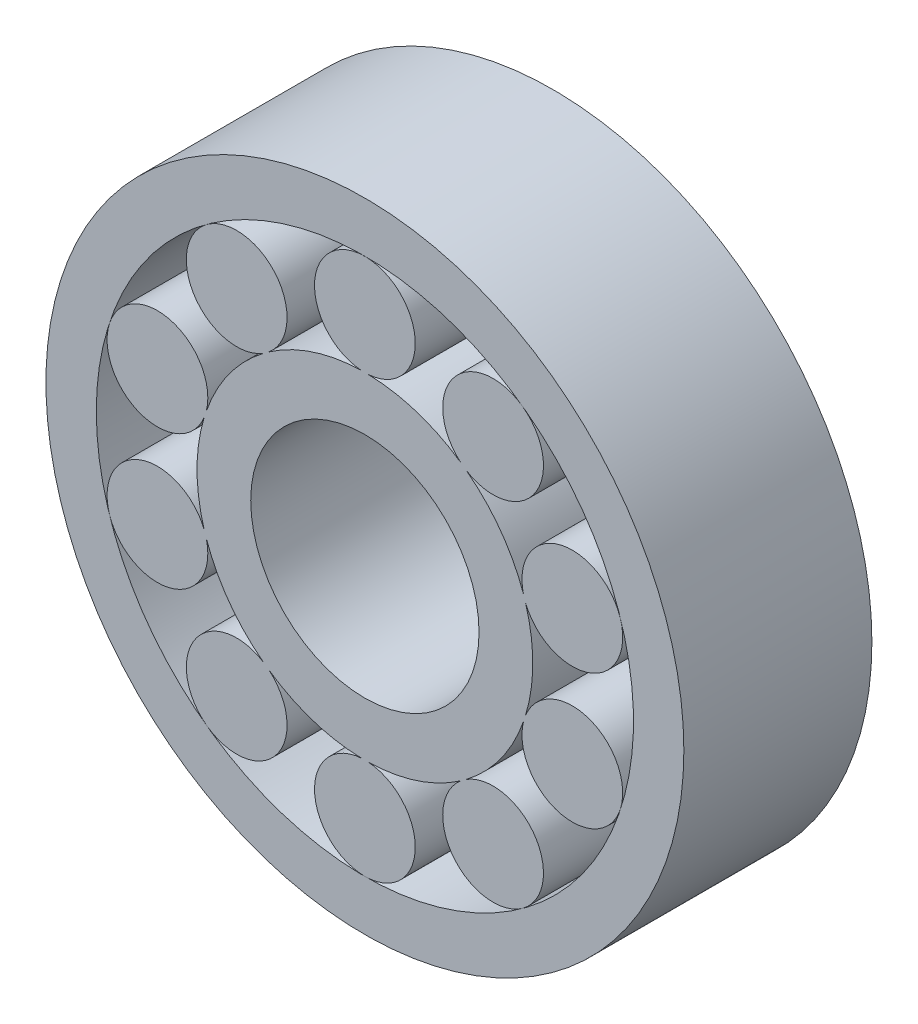
ISO-10303-21;
HEADER;
FILE_DESCRIPTION(('STEP AP214'),'2;1');
FILE_NAME('part.step','',(''),(''),'','','');
FILE_SCHEMA(('AUTOMOTIVE_DESIGN { 1 0 10303 214 1 1 1 1 }'));
ENDSEC;
DATA;
#1=APPLICATION_CONTEXT('core data for automotive mechanical design processes');
#2=APPLICATION_PROTOCOL_DEFINITION('international standard','automotive_design',2000,#1);
#3=PRODUCT_CONTEXT('',#1,'mechanical');
#4=PRODUCT('Part','Part','',(#3));
#5=PRODUCT_RELATED_PRODUCT_CATEGORY('part','',(#4));
#6=PRODUCT_DEFINITION_FORMATION('','',#4);
#7=PRODUCT_DEFINITION_CONTEXT('part definition',#1,'design');
#8=PRODUCT_DEFINITION('design','',#6,#7);
#9=PRODUCT_DEFINITION_SHAPE('','',#8);
#10=(LENGTH_UNIT() NAMED_UNIT(*) SI_UNIT(.MILLI.,.METRE.));
#11=(NAMED_UNIT(*) PLANE_ANGLE_UNIT() SI_UNIT($,.RADIAN.));
#12=(NAMED_UNIT(*) SI_UNIT($,.STERADIAN.) SOLID_ANGLE_UNIT());
#13=UNCERTAINTY_MEASURE_WITH_UNIT(LENGTH_MEASURE(1.E-05),#10,'distance_accuracy_value','');
#14=(GEOMETRIC_REPRESENTATION_CONTEXT(3) GLOBAL_UNCERTAINTY_ASSIGNED_CONTEXT((#13)) GLOBAL_UNIT_ASSIGNED_CONTEXT((#10,
#11,#12)) REPRESENTATION_CONTEXT('',''));
#15=CARTESIAN_POINT('',(0.,0.,0.));
#16=DIRECTION('',(0.,0.,1.));
#17=DIRECTION('',(1.,0.,0.));
#18=AXIS2_PLACEMENT_3D('',#15,#16,#17);
#19=CARTESIAN_POINT('',(0.,0.,14.));
#20=DIRECTION('',(0.,0.,1.));
#21=DIRECTION('',(1.,0.,0.));
#22=AXIS2_PLACEMENT_3D('',#19,#20,#21);
#23=PLANE('',#22);
#24=CARTESIAN_POINT('',(0.,0.,14.));
#25=DIRECTION('',(0.,0.,-1.));
#26=DIRECTION('',(-1.,0.,0.));
#27=AXIS2_PLACEMENT_3D('',#24,#25,#26);
#28=CIRCLE('',#27,20.);
#29=CARTESIAN_POINT('',(-20.,0.,14.));
#30=VERTEX_POINT('',#29);
#31=EDGE_CURVE('E60',#30,#30,#28,.T.);
#32=ORIENTED_EDGE('',*,*,#31,.T.);
#33=EDGE_LOOP('',(#32));
#34=FACE_BOUND('',#33,.T.);
#35=CARTESIAN_POINT('',(0.,0.,14.));
#36=DIRECTION('',(0.,0.,1.));
#37=DIRECTION('',(1.,0.,0.));
#38=AXIS2_PLACEMENT_3D('',#35,#36,#37);
#39=CIRCLE('',#38,23.75);
#40=CARTESIAN_POINT('',(23.75,0.,14.));
#41=VERTEX_POINT('',#40);
#42=EDGE_CURVE('E63',#41,#41,#39,.T.);
#43=ORIENTED_EDGE('',*,*,#42,.T.);
#44=EDGE_LOOP('',(#43));
#45=FACE_BOUND('',#44,.T.);
#46=ADVANCED_FACE('F52',(#34,#45),#23,.T.);
#47=CARTESIAN_POINT('',(0.,0.,0.));
#48=DIRECTION('',(0.,0.,1.));
#49=DIRECTION('',(1.,0.,0.));
#50=AXIS2_PLACEMENT_3D('',#47,#48,#49);
#51=PLANE('',#50);
#52=CARTESIAN_POINT('',(0.,0.,0.));
#53=DIRECTION('',(0.,0.,-1.));
#54=DIRECTION('',(-1.,0.,0.));
#55=AXIS2_PLACEMENT_3D('',#52,#53,#54);
#56=CIRCLE('',#55,20.);
#57=CARTESIAN_POINT('',(-20.,0.,0.));
#58=VERTEX_POINT('',#57);
#59=EDGE_CURVE('E11',#58,#58,#56,.T.);
#60=ORIENTED_EDGE('',*,*,#59,.F.);
#61=EDGE_LOOP('',(#60));
#62=FACE_BOUND('',#61,.T.);
#63=CARTESIAN_POINT('',(0.,0.,0.));
#64=DIRECTION('',(0.,0.,1.));
#65=DIRECTION('',(1.,0.,0.));
#66=AXIS2_PLACEMENT_3D('',#63,#64,#65);
#67=CIRCLE('',#66,23.75);
#68=CARTESIAN_POINT('',(23.75,0.,0.));
#69=VERTEX_POINT('',#68);
#70=EDGE_CURVE('E62',#69,#69,#67,.T.);
#71=ORIENTED_EDGE('',*,*,#70,.F.);
#72=EDGE_LOOP('',(#71));
#73=FACE_BOUND('',#72,.T.);
#74=ADVANCED_FACE('F54',(#62,#73),#51,.F.);
#75=CARTESIAN_POINT('',(0.,0.,14.));
#76=DIRECTION('',(0.,0.,-1.));
#77=DIRECTION('',(-1.,0.,0.));
#78=AXIS2_PLACEMENT_3D('',#75,#76,#77);
#79=CYLINDRICAL_SURFACE('',#78,23.75);
#80=ORIENTED_EDGE('',*,*,#42,.F.);
#81=EDGE_LOOP('',(#80));
#82=FACE_BOUND('',#81,.T.);
#83=ORIENTED_EDGE('',*,*,#70,.T.);
#84=EDGE_LOOP('',(#83));
#85=FACE_BOUND('',#84,.T.);
#86=ADVANCED_FACE('F80',(#82,#85),#79,.T.);
#87=CARTESIAN_POINT('',(0.,0.,14.));
#88=DIRECTION('',(0.,0.,-1.));
#89=DIRECTION('',(-1.,0.,0.));
#90=AXIS2_PLACEMENT_3D('',#87,#88,#89);
#91=CYLINDRICAL_SURFACE('',#90,20.);
#92=ORIENTED_EDGE('',*,*,#31,.F.);
#93=EDGE_LOOP('',(#92));
#94=FACE_BOUND('',#93,.T.);
#95=ORIENTED_EDGE('',*,*,#59,.T.);
#96=EDGE_LOOP('',(#95));
#97=FACE_BOUND('',#96,.T.);
#98=ADVANCED_FACE('F73',(#94,#97),#91,.F.);
#99=CLOSED_SHELL('',(#46,#74,#86,#98));
#100=MANIFOLD_SOLID_BREP('B2',#99);
#101=CARTESIAN_POINT('',(0.,0.,14.));
#102=DIRECTION('',(0.,0.,-1.));
#103=DIRECTION('',(-1.,0.,0.));
#104=AXIS2_PLACEMENT_3D('',#101,#102,#103);
#105=CYLINDRICAL_SURFACE('',#104,12.5);
#106=DIRECTION('',(0.,0.,-1.));
#107=VECTOR('',#106,1.);
#108=CARTESIAN_POINT('',(7.54020102676842,9.96972258771128,7.));
#109=LINE('',#108,#107);
#110=CARTESIAN_POINT('',(7.54020102676835,9.96972258771133,14.));
#111=VERTEX_POINT('',#110);
#112=CARTESIAN_POINT('',(7.54020102676835,9.96972258771133,0.));
#113=VERTEX_POINT('',#112);
#114=EDGE_CURVE('E51',#111,#113,#109,.T.);
#115=ORIENTED_EDGE('',*,*,#114,.F.);
#116=CARTESIAN_POINT('',(0.,0.,14.));
#117=DIRECTION('',(0.,0.,-1.));
#118=DIRECTION('',(-1.,0.,0.));
#119=AXIS2_PLACEMENT_3D('',#116,#117,#118);
#120=CIRCLE('',#119,12.5);
#121=CARTESIAN_POINT('',(11.8118198909726,4.09034361187721,14.));
#122=VERTEX_POINT('',#121);
#123=EDGE_CURVE('E257',#111,#122,#120,.T.);
#124=ORIENTED_EDGE('',*,*,#123,.T.);
#125=DIRECTION('',(0.,0.,-1.));
#126=VECTOR('',#125,1.);
#127=CARTESIAN_POINT('',(11.8118198909726,4.09034361187724,7.));
#128=LINE('',#127,#126);
#129=CARTESIAN_POINT('',(11.8118198909726,4.09034361187721,0.));
#130=VERTEX_POINT('',#129);
#131=EDGE_CURVE('E424',#130,#122,#128,.F.);
#132=ORIENTED_EDGE('',*,*,#131,.F.);
#133=CARTESIAN_POINT('',(0.,0.,0.));
#134=DIRECTION('',(0.,0.,-1.));
#135=DIRECTION('',(-1.,0.,0.));
#136=AXIS2_PLACEMENT_3D('',#133,#134,#135);
#137=CIRCLE('',#136,12.5);
#138=EDGE_CURVE('E131',#113,#130,#137,.T.);
#139=ORIENTED_EDGE('',*,*,#138,.F.);
#140=EDGE_LOOP('',(#115,#124,#132,#139));
#141=FACE_BOUND('',#140,.T.);
#142=ADVANCED_FACE('F113',(#141),#105,.T.);
#143=DIRECTION('',(0.,0.,-1.));
#144=VECTOR('',#143,1.);
#145=CARTESIAN_POINT('',(11.9602066781629,3.63365603980714,7.));
#146=LINE('',#145,#144);
#147=CARTESIAN_POINT('',(11.9602066781629,3.63365603980717,14.));
#148=VERTEX_POINT('',#147);
#149=CARTESIAN_POINT('',(11.9602066781629,3.63365603980717,0.));
#150=VERTEX_POINT('',#149);
#151=EDGE_CURVE('E271',#148,#150,#146,.T.);
#152=ORIENTED_EDGE('',*,*,#151,.F.);
#153=CARTESIAN_POINT('',(11.960206678163,-3.63365603980698,14.));
#154=VERTEX_POINT('',#153);
#155=EDGE_CURVE('E442',#148,#154,#120,.T.);
#156=ORIENTED_EDGE('',*,*,#155,.T.);
#157=DIRECTION('',(0.,0.,-1.));
#158=VECTOR('',#157,1.);
#159=CARTESIAN_POINT('',(11.960206678163,-3.63365603980689,7.));
#160=LINE('',#159,#158);
#161=CARTESIAN_POINT('',(11.960206678163,-3.63365603980698,0.));
#162=VERTEX_POINT('',#161);
#163=EDGE_CURVE('E418',#162,#154,#160,.F.);
#164=ORIENTED_EDGE('',*,*,#163,.F.);
#165=EDGE_CURVE('E440',#150,#162,#137,.T.);
#166=ORIENTED_EDGE('',*,*,#165,.F.);
#167=EDGE_LOOP('',(#152,#156,#164,#166));
#168=FACE_BOUND('',#167,.T.);
#169=ADVANCED_FACE('F536',(#168),#105,.T.);
#170=DIRECTION('',(0.,0.,-1.));
#171=VECTOR('',#170,1.);
#172=CARTESIAN_POINT('',(11.8118198909727,-4.090343611877,7.));
#173=LINE('',#172,#171);
#174=CARTESIAN_POINT('',(11.8118198909727,-4.09034361187691,14.));
#175=VERTEX_POINT('',#174);
#176=CARTESIAN_POINT('',(11.8118198909727,-4.09034361187691,0.));
#177=VERTEX_POINT('',#176);
#178=EDGE_CURVE('E419',#175,#177,#173,.T.);
#179=ORIENTED_EDGE('',*,*,#178,.F.);
#180=CARTESIAN_POINT('',(7.54020102676856,-9.96972258771117,14.));
#181=VERTEX_POINT('',#180);
#182=EDGE_CURVE('E441',#175,#181,#120,.T.);
#183=ORIENTED_EDGE('',*,*,#182,.T.);
#184=DIRECTION('',(0.,0.,-1.));
#185=VECTOR('',#184,1.);
#186=CARTESIAN_POINT('',(7.54020102676864,-9.96972258771112,7.));
#187=LINE('',#186,#185);
#188=CARTESIAN_POINT('',(7.54020102676856,-9.96972258771117,0.));
#189=VERTEX_POINT('',#188);
#190=EDGE_CURVE('E409',#189,#181,#187,.F.);
#191=ORIENTED_EDGE('',*,*,#190,.F.);
#192=EDGE_CURVE('E494',#177,#189,#137,.T.);
#193=ORIENTED_EDGE('',*,*,#192,.F.);
#194=EDGE_LOOP('',(#179,#183,#191,#193));
#195=FACE_BOUND('',#194,.T.);
#196=ADVANCED_FACE('F498',(#195),#105,.T.);
#197=DIRECTION('',(0.,0.,-1.));
#198=VECTOR('',#197,1.);
#199=CARTESIAN_POINT('',(7.15171937442288,-10.2519710294901,7.));
#200=LINE('',#199,#198);
#201=CARTESIAN_POINT('',(7.15171937442296,-10.2519710294901,14.));
#202=VERTEX_POINT('',#201);
#203=CARTESIAN_POINT('',(7.15171937442296,-10.2519710294901,0.));
#204=VERTEX_POINT('',#203);
#205=EDGE_CURVE('E415',#202,#204,#200,.T.);
#206=ORIENTED_EDGE('',*,*,#205,.F.);
#207=CARTESIAN_POINT('',(0.240094865155398,-12.4976939655172,14.));
#208=VERTEX_POINT('',#207);
#209=EDGE_CURVE('E450',#202,#208,#120,.T.);
#210=ORIENTED_EDGE('',*,*,#209,.T.);
#211=DIRECTION('',(0.,0.,-1.));
#212=VECTOR('',#211,1.);
#213=CARTESIAN_POINT('',(0.240094865155489,-12.4976939655172,7.));
#214=LINE('',#213,#212);
#215=CARTESIAN_POINT('',(0.240094865155398,-12.4976939655172,0.));
#216=VERTEX_POINT('',#215);
#217=EDGE_CURVE('E399',#216,#208,#214,.F.);
#218=ORIENTED_EDGE('',*,*,#217,.F.);
#219=EDGE_CURVE('E492',#204,#216,#137,.T.);
#220=ORIENTED_EDGE('',*,*,#219,.F.);
#221=EDGE_LOOP('',(#206,#210,#218,#220));
#222=FACE_BOUND('',#221,.T.);
#223=ADVANCED_FACE('F501',(#222),#105,.T.);
#224=DIRECTION('',(0.,0.,-1.));
#225=VECTOR('',#224,1.);
#226=CARTESIAN_POINT('',(-0.240094865155314,-12.4976939655172,7.));
#227=LINE('',#226,#225);
#228=CARTESIAN_POINT('',(-0.240094865155223,-12.4976939655172,14.));
#229=VERTEX_POINT('',#228);
#230=CARTESIAN_POINT('',(-0.240094865155223,-12.4976939655172,0.));
#231=VERTEX_POINT('',#230);
#232=EDGE_CURVE('E404',#229,#231,#227,.T.);
#233=ORIENTED_EDGE('',*,*,#232,.F.);
#234=CARTESIAN_POINT('',(-7.15171937442281,-10.2519710294902,14.));
#235=VERTEX_POINT('',#234);
#236=EDGE_CURVE('E451',#229,#235,#120,.T.);
#237=ORIENTED_EDGE('',*,*,#236,.T.);
#238=DIRECTION('',(0.,0.,-1.));
#239=VECTOR('',#238,1.);
#240=CARTESIAN_POINT('',(-7.15171937442273,-10.2519710294902,7.));
#241=LINE('',#240,#239);
#242=CARTESIAN_POINT('',(-7.15171937442281,-10.2519710294902,0.));
#243=VERTEX_POINT('',#242);
#244=EDGE_CURVE('E395',#243,#235,#241,.F.);
#245=ORIENTED_EDGE('',*,*,#244,.F.);
#246=EDGE_CURVE('E491',#231,#243,#137,.T.);
#247=ORIENTED_EDGE('',*,*,#246,.F.);
#248=EDGE_LOOP('',(#233,#237,#245,#247));
#249=FACE_BOUND('',#248,.T.);
#250=ADVANCED_FACE('F509',(#249),#105,.T.);
#251=DIRECTION('',(0.,0.,-1.));
#252=VECTOR('',#251,1.);
#253=CARTESIAN_POINT('',(-7.5402010267685,-9.96972258771123,7.));
#254=LINE('',#253,#252);
#255=CARTESIAN_POINT('',(-7.54020102676841,-9.96972258771129,14.));
#256=VERTEX_POINT('',#255);
#257=CARTESIAN_POINT('',(-7.54020102676841,-9.96972258771129,0.));
#258=VERTEX_POINT('',#257);
#259=EDGE_CURVE('E396',#256,#258,#254,.T.);
#260=ORIENTED_EDGE('',*,*,#259,.F.);
#261=CARTESIAN_POINT('',(-11.8118198909726,-4.09034361187703,14.));
#262=VERTEX_POINT('',#261);
#263=EDGE_CURVE('E457',#256,#262,#120,.T.);
#264=ORIENTED_EDGE('',*,*,#263,.T.);
#265=DIRECTION('',(0.,0.,-1.));
#266=VECTOR('',#265,1.);
#267=CARTESIAN_POINT('',(-11.8118198909726,-4.09034361187716,7.));
#268=LINE('',#267,#266);
#269=CARTESIAN_POINT('',(-11.8118198909726,-4.09034361187703,0.));
#270=VERTEX_POINT('',#269);
#271=EDGE_CURVE('E383',#270,#262,#268,.F.);
#272=ORIENTED_EDGE('',*,*,#271,.F.);
#273=EDGE_CURVE('E487',#258,#270,#137,.T.);
#274=ORIENTED_EDGE('',*,*,#273,.F.);
#275=EDGE_LOOP('',(#260,#264,#272,#274));
#276=FACE_BOUND('',#275,.T.);
#277=ADVANCED_FACE('F514',(#276),#105,.T.);
#278=DIRECTION('',(0.,0.,-1.));
#279=VECTOR('',#278,1.);
#280=CARTESIAN_POINT('',(-11.960206678163,-3.63365603980706,7.));
#281=LINE('',#280,#279);
#282=CARTESIAN_POINT('',(-11.9602066781629,-3.63365603980719,14.));
#283=VERTEX_POINT('',#282);
#284=CARTESIAN_POINT('',(-11.9602066781629,-3.63365603980719,0.));
#285=VERTEX_POINT('',#284);
#286=EDGE_CURVE('E389',#283,#285,#281,.T.);
#287=ORIENTED_EDGE('',*,*,#286,.F.);
#288=CARTESIAN_POINT('',(-11.9602066781629,3.63365603980709,14.));
#289=VERTEX_POINT('',#288);
#290=EDGE_CURVE('E462',#283,#289,#120,.T.);
#291=ORIENTED_EDGE('',*,*,#290,.T.);
#292=DIRECTION('',(0.,0.,-1.));
#293=VECTOR('',#292,1.);
#294=CARTESIAN_POINT('',(-11.960206678163,3.63365603980697,7.));
#295=LINE('',#294,#293);
#296=CARTESIAN_POINT('',(-11.9602066781629,3.6336560398071,0.));
#297=VERTEX_POINT('',#296);
#298=EDGE_CURVE('E376',#297,#289,#295,.F.);
#299=ORIENTED_EDGE('',*,*,#298,.F.);
#300=EDGE_CURVE('E490',#285,#297,#137,.T.);
#301=ORIENTED_EDGE('',*,*,#300,.F.);
#302=EDGE_LOOP('',(#287,#291,#299,#301));
#303=FACE_BOUND('',#302,.T.);
#304=ADVANCED_FACE('F518',(#303),#105,.T.);
#305=DIRECTION('',(0.,0.,-1.));
#306=VECTOR('',#305,1.);
#307=CARTESIAN_POINT('',(-11.8118198909726,4.09034361187708,7.));
#308=LINE('',#307,#306);
#309=CARTESIAN_POINT('',(-11.8118198909727,4.09034361187695,14.));
#310=VERTEX_POINT('',#309);
#311=CARTESIAN_POINT('',(-11.8118198909727,4.09034361187695,0.));
#312=VERTEX_POINT('',#311);
#313=EDGE_CURVE('E379',#310,#312,#308,.T.);
#314=ORIENTED_EDGE('',*,*,#313,.F.);
#315=CARTESIAN_POINT('',(-7.54020102676846,9.96972258771125,14.));
#316=VERTEX_POINT('',#315);
#317=EDGE_CURVE('E466',#310,#316,#120,.T.);
#318=ORIENTED_EDGE('',*,*,#317,.T.);
#319=DIRECTION('',(0.,0.,-1.));
#320=VECTOR('',#319,1.);
#321=CARTESIAN_POINT('',(-7.54020102676852,9.96972258771121,7.));
#322=LINE('',#321,#320);
#323=CARTESIAN_POINT('',(-7.54020102676846,9.96972258771125,0.));
#324=VERTEX_POINT('',#323);
#325=EDGE_CURVE('E366',#324,#316,#322,.F.);
#326=ORIENTED_EDGE('',*,*,#325,.F.);
#327=EDGE_CURVE('E484',#312,#324,#137,.T.);
#328=ORIENTED_EDGE('',*,*,#327,.F.);
#329=EDGE_LOOP('',(#314,#318,#326,#328));
#330=FACE_BOUND('',#329,.T.);
#331=ADVANCED_FACE('F523',(#330),#105,.T.);
#332=DIRECTION('',(0.,0.,-1.));
#333=VECTOR('',#332,1.);
#334=CARTESIAN_POINT('',(-7.15171937442285,10.2519710294901,7.));
#335=LINE('',#334,#333);
#336=CARTESIAN_POINT('',(-7.15171937442291,10.2519710294901,14.));
#337=VERTEX_POINT('',#336);
#338=CARTESIAN_POINT('',(-7.15171937442291,10.2519710294901,0.));
#339=VERTEX_POINT('',#338);
#340=EDGE_CURVE('E375',#337,#339,#335,.T.);
#341=ORIENTED_EDGE('',*,*,#340,.F.);
#342=CARTESIAN_POINT('',(-0.240094865155303,12.4976939655172,14.));
#343=VERTEX_POINT('',#342);
#344=EDGE_CURVE('E265',#337,#343,#120,.T.);
#345=ORIENTED_EDGE('',*,*,#344,.T.);
#346=DIRECTION('',(0.,0.,-1.));
#347=VECTOR('',#346,1.);
#348=CARTESIAN_POINT('',(-0.240094865155402,12.4976939655172,7.));
#349=LINE('',#348,#347);
#350=CARTESIAN_POINT('',(-0.240094865155303,12.4976939655172,0.));
#351=VERTEX_POINT('',#350);
#352=EDGE_CURVE('E358',#351,#343,#349,.F.);
#353=ORIENTED_EDGE('',*,*,#352,.F.);
#354=EDGE_CURVE('E346',#339,#351,#137,.T.);
#355=ORIENTED_EDGE('',*,*,#354,.F.);
#356=EDGE_LOOP('',(#341,#345,#353,#355));
#357=FACE_BOUND('',#356,.T.);
#358=ADVANCED_FACE('F476',(#357),#105,.T.);
#359=CARTESIAN_POINT('',(0.,0.,14.));
#360=DIRECTION('',(0.,0.,1.));
#361=DIRECTION('',(1.,0.,0.));
#362=AXIS2_PLACEMENT_3D('',#359,#360,#361);
#363=PLANE('',#362);
#364=ORIENTED_EDGE('',*,*,#123,.F.);
#365=CARTESIAN_POINT('',(9.54563249722959,13.1384359886493,14.));
#366=DIRECTION('',(0.,0.,-1.));
#367=DIRECTION('',(-1.,0.,0.));
#368=AXIS2_PLACEMENT_3D('',#365,#366,#367);
#369=CIRCLE('',#368,3.75);
#370=CARTESIAN_POINT('',(7.15171937442272,10.2519710294902,14.));
#371=VERTEX_POINT('',#370);
#372=EDGE_CURVE('E270',#371,#111,#369,.T.);
#373=ORIENTED_EDGE('',*,*,#372,.F.);
#374=CARTESIAN_POINT('',(0.240094865155303,12.4976939655172,14.));
#375=VERTEX_POINT('',#374);
#376=EDGE_CURVE('E247',#375,#371,#120,.T.);
#377=ORIENTED_EDGE('',*,*,#376,.F.);
#378=CARTESIAN_POINT('',(0.,16.24,14.));
#379=DIRECTION('',(0.,0.,-1.));
#380=DIRECTION('',(-1.,0.,0.));
#381=AXIS2_PLACEMENT_3D('',#378,#379,#380);
#382=CIRCLE('',#381,3.75);
#383=EDGE_CURVE('E344',#343,#375,#382,.T.);
#384=ORIENTED_EDGE('',*,*,#383,.F.);
#385=ORIENTED_EDGE('',*,*,#344,.F.);
#386=CARTESIAN_POINT('',(-9.54563249722978,13.1384359886491,14.));
#387=DIRECTION('',(0.,0.,-1.));
#388=DIRECTION('',(-1.,0.,0.));
#389=AXIS2_PLACEMENT_3D('',#386,#387,#388);
#390=CIRCLE('',#389,3.75);
#391=EDGE_CURVE('E334',#316,#337,#390,.T.);
#392=ORIENTED_EDGE('',*,*,#391,.F.);
#393=ORIENTED_EDGE('',*,*,#317,.F.);
#394=CARTESIAN_POINT('',(-15.4451578246333,5.0184359886491,14.));
#395=DIRECTION('',(0.,0.,-1.));
#396=DIRECTION('',(-1.,0.,0.));
#397=AXIS2_PLACEMENT_3D('',#394,#395,#396);
#398=CIRCLE('',#397,3.75);
#399=EDGE_CURVE('E324',#289,#310,#398,.T.);
#400=ORIENTED_EDGE('',*,*,#399,.F.);
#401=ORIENTED_EDGE('',*,*,#290,.F.);
#402=CARTESIAN_POINT('',(-15.4451578246333,-5.01843598864921,14.));
#403=DIRECTION('',(0.,0.,-1.));
#404=DIRECTION('',(-1.,0.,0.));
#405=AXIS2_PLACEMENT_3D('',#402,#403,#404);
#406=CIRCLE('',#405,3.75);
#407=EDGE_CURVE('E320',#262,#283,#406,.T.);
#408=ORIENTED_EDGE('',*,*,#407,.F.);
#409=ORIENTED_EDGE('',*,*,#263,.F.);
#410=CARTESIAN_POINT('',(-9.54563249722968,-13.1384359886492,14.));
#411=DIRECTION('',(0.,0.,-1.));
#412=DIRECTION('',(-1.,0.,0.));
#413=AXIS2_PLACEMENT_3D('',#410,#411,#412);
#414=CIRCLE('',#413,3.75);
#415=EDGE_CURVE('E310',#235,#256,#414,.T.);
#416=ORIENTED_EDGE('',*,*,#415,.F.);
#417=ORIENTED_EDGE('',*,*,#236,.F.);
#418=CARTESIAN_POINT('',(1.13403313885625E-13,-16.24,14.));
#419=DIRECTION('',(0.,0.,-1.));
#420=DIRECTION('',(-1.,0.,0.));
#421=AXIS2_PLACEMENT_3D('',#418,#419,#420);
#422=CIRCLE('',#421,3.75);
#423=EDGE_CURVE('E301',#208,#229,#422,.T.);
#424=ORIENTED_EDGE('',*,*,#423,.F.);
#425=ORIENTED_EDGE('',*,*,#209,.F.);
#426=CARTESIAN_POINT('',(9.54563249722988,-13.1384359886491,14.));
#427=DIRECTION('',(0.,0.,-1.));
#428=DIRECTION('',(-1.,0.,0.));
#429=AXIS2_PLACEMENT_3D('',#426,#427,#428);
#430=CIRCLE('',#429,3.75);
#431=EDGE_CURVE('E291',#181,#202,#430,.T.);
#432=ORIENTED_EDGE('',*,*,#431,.F.);
#433=ORIENTED_EDGE('',*,*,#182,.F.);
#434=CARTESIAN_POINT('',(15.4451578246333,-5.018435988649,14.));
#435=DIRECTION('',(0.,0.,-1.));
#436=DIRECTION('',(-1.,0.,0.));
#437=AXIS2_PLACEMENT_3D('',#434,#435,#436);
#438=CIRCLE('',#437,3.75);
#439=EDGE_CURVE('E283',#154,#175,#438,.T.);
#440=ORIENTED_EDGE('',*,*,#439,.F.);
#441=ORIENTED_EDGE('',*,*,#155,.F.);
#442=CARTESIAN_POINT('',(15.4451578246332,5.01843598864932,14.));
#443=DIRECTION('',(0.,0.,-1.));
#444=DIRECTION('',(-1.,0.,0.));
#445=AXIS2_PLACEMENT_3D('',#442,#443,#444);
#446=CIRCLE('',#445,3.75);
#447=EDGE_CURVE('E279',#122,#148,#446,.T.);
#448=ORIENTED_EDGE('',*,*,#447,.F.);
#449=EDGE_LOOP('',(#364,#373,#377,#384,#385,#392,#393,#400,#401,#408,#409,#416,#417,#424,#425,
#432,#433,#440,#441,#448));
#450=FACE_BOUND('',#449,.T.);
#451=CARTESIAN_POINT('',(0.,0.,14.));
#452=DIRECTION('',(0.,0.,1.));
#453=DIRECTION('',(1.,0.,0.));
#454=AXIS2_PLACEMENT_3D('',#451,#452,#453);
#455=CIRCLE('',#454,8.5);
#456=CARTESIAN_POINT('',(8.5,0.,14.));
#457=VERTEX_POINT('',#456);
#458=EDGE_CURVE('E353',#457,#457,#455,.T.);
#459=ORIENTED_EDGE('',*,*,#458,.F.);
#460=EDGE_LOOP('',(#459));
#461=FACE_BOUND('',#460,.T.);
#462=ADVANCED_FACE('F275',(#450,#461),#363,.T.);
#463=CARTESIAN_POINT('',(0.,0.,14.));
#464=DIRECTION('',(0.,0.,-1.));
#465=DIRECTION('',(-1.,0.,0.));
#466=AXIS2_PLACEMENT_3D('',#463,#464,#465);
#467=CYLINDRICAL_SURFACE('',#466,8.5);
#468=ORIENTED_EDGE('',*,*,#458,.T.);
#469=EDGE_LOOP('',(#468));
#470=FACE_BOUND('',#469,.T.);
#471=CARTESIAN_POINT('',(0.,0.,0.));
#472=DIRECTION('',(0.,0.,1.));
#473=DIRECTION('',(1.,0.,0.));
#474=AXIS2_PLACEMENT_3D('',#471,#472,#473);
#475=CIRCLE('',#474,8.5);
#476=CARTESIAN_POINT('',(8.5,0.,0.));
#477=VERTEX_POINT('',#476);
#478=EDGE_CURVE('E259',#477,#477,#475,.T.);
#479=ORIENTED_EDGE('',*,*,#478,.F.);
#480=EDGE_LOOP('',(#479));
#481=FACE_BOUND('',#480,.T.);
#482=ADVANCED_FACE('F550',(#470,#481),#467,.F.);
#483=CARTESIAN_POINT('',(0.,0.,0.));
#484=DIRECTION('',(0.,0.,1.));
#485=DIRECTION('',(1.,0.,0.));
#486=AXIS2_PLACEMENT_3D('',#483,#484,#485);
#487=PLANE('',#486);
#488=CARTESIAN_POINT('',(0.240094865155303,12.4976939655172,0.));
#489=VERTEX_POINT('',#488);
#490=CARTESIAN_POINT('',(7.15171937442273,10.2519710294902,0.));
#491=VERTEX_POINT('',#490);
#492=EDGE_CURVE('E355',#489,#491,#137,.T.);
#493=ORIENTED_EDGE('',*,*,#492,.T.);
#494=CARTESIAN_POINT('',(9.54563249722959,13.1384359886493,0.));
#495=DIRECTION('',(0.,0.,-1.));
#496=DIRECTION('',(-1.,0.,0.));
#497=AXIS2_PLACEMENT_3D('',#494,#495,#496);
#498=CIRCLE('',#497,3.75);
#499=EDGE_CURVE('E267',#491,#113,#498,.T.);
#500=ORIENTED_EDGE('',*,*,#499,.T.);
#501=ORIENTED_EDGE('',*,*,#138,.T.);
#502=CARTESIAN_POINT('',(15.4451578246332,5.01843598864932,0.));
#503=DIRECTION('',(0.,0.,-1.));
#504=DIRECTION('',(-1.,0.,0.));
#505=AXIS2_PLACEMENT_3D('',#502,#503,#504);
#506=CIRCLE('',#505,3.75);
#507=EDGE_CURVE('E282',#130,#150,#506,.T.);
#508=ORIENTED_EDGE('',*,*,#507,.T.);
#509=ORIENTED_EDGE('',*,*,#165,.T.);
#510=CARTESIAN_POINT('',(15.4451578246333,-5.018435988649,0.));
#511=DIRECTION('',(0.,0.,-1.));
#512=DIRECTION('',(-1.,0.,0.));
#513=AXIS2_PLACEMENT_3D('',#510,#511,#512);
#514=CIRCLE('',#513,3.75);
#515=EDGE_CURVE('E288',#162,#177,#514,.T.);
#516=ORIENTED_EDGE('',*,*,#515,.T.);
#517=ORIENTED_EDGE('',*,*,#192,.T.);
#518=CARTESIAN_POINT('',(9.54563249722988,-13.1384359886491,0.));
#519=DIRECTION('',(0.,0.,-1.));
#520=DIRECTION('',(-1.,0.,0.));
#521=AXIS2_PLACEMENT_3D('',#518,#519,#520);
#522=CIRCLE('',#521,3.75);
#523=EDGE_CURVE('E300',#189,#204,#522,.T.);
#524=ORIENTED_EDGE('',*,*,#523,.T.);
#525=ORIENTED_EDGE('',*,*,#219,.T.);
#526=CARTESIAN_POINT('',(1.13403313885625E-13,-16.24,0.));
#527=DIRECTION('',(0.,0.,-1.));
#528=DIRECTION('',(-1.,0.,0.));
#529=AXIS2_PLACEMENT_3D('',#526,#527,#528);
#530=CIRCLE('',#529,3.75);
#531=EDGE_CURVE('E304',#216,#231,#530,.T.);
#532=ORIENTED_EDGE('',*,*,#531,.T.);
#533=ORIENTED_EDGE('',*,*,#246,.T.);
#534=CARTESIAN_POINT('',(-9.54563249722968,-13.1384359886492,0.));
#535=DIRECTION('',(0.,0.,-1.));
#536=DIRECTION('',(-1.,0.,0.));
#537=AXIS2_PLACEMENT_3D('',#534,#535,#536);
#538=CIRCLE('',#537,3.75);
#539=EDGE_CURVE('E311',#243,#258,#538,.T.);
#540=ORIENTED_EDGE('',*,*,#539,.T.);
#541=ORIENTED_EDGE('',*,*,#273,.T.);
#542=CARTESIAN_POINT('',(-15.4451578246333,-5.01843598864921,0.));
#543=DIRECTION('',(0.,0.,-1.));
#544=DIRECTION('',(-1.,0.,0.));
#545=AXIS2_PLACEMENT_3D('',#542,#543,#544);
#546=CIRCLE('',#545,3.75);
#547=EDGE_CURVE('E321',#270,#285,#546,.T.);
#548=ORIENTED_EDGE('',*,*,#547,.T.);
#549=ORIENTED_EDGE('',*,*,#300,.T.);
#550=CARTESIAN_POINT('',(-15.4451578246333,5.0184359886491,0.));
#551=DIRECTION('',(0.,0.,-1.));
#552=DIRECTION('',(-1.,0.,0.));
#553=AXIS2_PLACEMENT_3D('',#550,#551,#552);
#554=CIRCLE('',#553,3.75);
#555=EDGE_CURVE('E328',#297,#312,#554,.T.);
#556=ORIENTED_EDGE('',*,*,#555,.T.);
#557=ORIENTED_EDGE('',*,*,#327,.T.);
#558=CARTESIAN_POINT('',(-9.54563249722978,13.1384359886491,0.));
#559=DIRECTION('',(0.,0.,-1.));
#560=DIRECTION('',(-1.,0.,0.));
#561=AXIS2_PLACEMENT_3D('',#558,#559,#560);
#562=CIRCLE('',#561,3.75);
#563=EDGE_CURVE('E340',#324,#339,#562,.T.);
#564=ORIENTED_EDGE('',*,*,#563,.T.);
#565=ORIENTED_EDGE('',*,*,#354,.T.);
#566=CARTESIAN_POINT('',(0.,16.24,0.));
#567=DIRECTION('',(0.,0.,-1.));
#568=DIRECTION('',(-1.,0.,0.));
#569=AXIS2_PLACEMENT_3D('',#566,#567,#568);
#570=CIRCLE('',#569,3.75);
#571=EDGE_CURVE('E341',#351,#489,#570,.T.);
#572=ORIENTED_EDGE('',*,*,#571,.T.);
#573=EDGE_LOOP('',(#493,#500,#501,#508,#509,#516,#517,#524,#525,#532,#533,#540,#541,#548,#549,
#556,#557,#564,#565,#572));
#574=FACE_BOUND('',#573,.T.);
#575=ORIENTED_EDGE('',*,*,#478,.T.);
#576=EDGE_LOOP('',(#575));
#577=FACE_BOUND('',#576,.T.);
#578=ADVANCED_FACE('F120',(#574,#577),#487,.F.);
#579=DIRECTION('',(0.,0.,-1.));
#580=VECTOR('',#579,1.);
#581=CARTESIAN_POINT('',(7.15171937442266,10.2519710294903,7.));
#582=LINE('',#581,#580);
#583=EDGE_CURVE('E123',#491,#371,#582,.F.);
#584=ORIENTED_EDGE('',*,*,#583,.F.);
#585=ORIENTED_EDGE('',*,*,#492,.F.);
#586=DIRECTION('',(0.,0.,-1.));
#587=VECTOR('',#586,1.);
#588=CARTESIAN_POINT('',(0.240094865155402,12.4976939655172,7.));
#589=LINE('',#588,#587);
#590=EDGE_CURVE('E251',#375,#489,#589,.T.);
#591=ORIENTED_EDGE('',*,*,#590,.F.);
#592=ORIENTED_EDGE('',*,*,#376,.T.);
#593=EDGE_LOOP('',(#584,#585,#591,#592));
#594=FACE_BOUND('',#593,.T.);
#595=ADVANCED_FACE('F249',(#594),#105,.T.);
#596=CARTESIAN_POINT('',(0.,16.24,14.));
#597=DIRECTION('',(0.,0.,-1.));
#598=DIRECTION('',(-1.,0.,0.));
#599=AXIS2_PLACEMENT_3D('',#596,#597,#598);
#600=CYLINDRICAL_SURFACE('',#599,3.75);
#601=ORIENTED_EDGE('',*,*,#383,.T.);
#602=ORIENTED_EDGE('',*,*,#590,.T.);
#603=ORIENTED_EDGE('',*,*,#571,.F.);
#604=ORIENTED_EDGE('',*,*,#352,.T.);
#605=EDGE_LOOP('',(#601,#602,#603,#604));
#606=FACE_BOUND('',#605,.T.);
#607=ADVANCED_FACE('F485',(#606),#600,.T.);
#608=CARTESIAN_POINT('',(-9.54563249722978,13.1384359886491,14.));
#609=DIRECTION('',(0.,0.,-1.));
#610=DIRECTION('',(-1.,0.,0.));
#611=AXIS2_PLACEMENT_3D('',#608,#609,#610);
#612=CYLINDRICAL_SURFACE('',#611,3.75);
#613=ORIENTED_EDGE('',*,*,#391,.T.);
#614=ORIENTED_EDGE('',*,*,#340,.T.);
#615=ORIENTED_EDGE('',*,*,#563,.F.);
#616=ORIENTED_EDGE('',*,*,#325,.T.);
#617=EDGE_LOOP('',(#613,#614,#615,#616));
#618=FACE_BOUND('',#617,.T.);
#619=ADVANCED_FACE('F528',(#618),#612,.T.);
#620=CARTESIAN_POINT('',(-15.4451578246333,5.0184359886491,14.));
#621=DIRECTION('',(0.,0.,-1.));
#622=DIRECTION('',(-1.,0.,0.));
#623=AXIS2_PLACEMENT_3D('',#620,#621,#622);
#624=CYLINDRICAL_SURFACE('',#623,3.75);
#625=ORIENTED_EDGE('',*,*,#399,.T.);
#626=ORIENTED_EDGE('',*,*,#313,.T.);
#627=ORIENTED_EDGE('',*,*,#555,.F.);
#628=ORIENTED_EDGE('',*,*,#298,.T.);
#629=EDGE_LOOP('',(#625,#626,#627,#628));
#630=FACE_BOUND('',#629,.T.);
#631=ADVANCED_FACE('F522',(#630),#624,.T.);
#632=CARTESIAN_POINT('',(-15.4451578246333,-5.01843598864921,14.));
#633=DIRECTION('',(0.,0.,-1.));
#634=DIRECTION('',(-1.,0.,0.));
#635=AXIS2_PLACEMENT_3D('',#632,#633,#634);
#636=CYLINDRICAL_SURFACE('',#635,3.75);
#637=ORIENTED_EDGE('',*,*,#407,.T.);
#638=ORIENTED_EDGE('',*,*,#286,.T.);
#639=ORIENTED_EDGE('',*,*,#547,.F.);
#640=ORIENTED_EDGE('',*,*,#271,.T.);
#641=EDGE_LOOP('',(#637,#638,#639,#640));
#642=FACE_BOUND('',#641,.T.);
#643=ADVANCED_FACE('F519',(#642),#636,.T.);
#644=CARTESIAN_POINT('',(-9.54563249722968,-13.1384359886492,14.));
#645=DIRECTION('',(0.,0.,-1.));
#646=DIRECTION('',(-1.,0.,0.));
#647=AXIS2_PLACEMENT_3D('',#644,#645,#646);
#648=CYLINDRICAL_SURFACE('',#647,3.75);
#649=ORIENTED_EDGE('',*,*,#415,.T.);
#650=ORIENTED_EDGE('',*,*,#259,.T.);
#651=ORIENTED_EDGE('',*,*,#539,.F.);
#652=ORIENTED_EDGE('',*,*,#244,.T.);
#653=EDGE_LOOP('',(#649,#650,#651,#652));
#654=FACE_BOUND('',#653,.T.);
#655=ADVANCED_FACE('F511',(#654),#648,.T.);
#656=CARTESIAN_POINT('',(1.13403313885625E-13,-16.24,14.));
#657=DIRECTION('',(0.,0.,-1.));
#658=DIRECTION('',(-1.,0.,0.));
#659=AXIS2_PLACEMENT_3D('',#656,#657,#658);
#660=CYLINDRICAL_SURFACE('',#659,3.75);
#661=ORIENTED_EDGE('',*,*,#423,.T.);
#662=ORIENTED_EDGE('',*,*,#232,.T.);
#663=ORIENTED_EDGE('',*,*,#531,.F.);
#664=ORIENTED_EDGE('',*,*,#217,.T.);
#665=EDGE_LOOP('',(#661,#662,#663,#664));
#666=FACE_BOUND('',#665,.T.);
#667=ADVANCED_FACE('F507',(#666),#660,.T.);
#668=CARTESIAN_POINT('',(9.54563249722988,-13.1384359886491,14.));
#669=DIRECTION('',(0.,0.,-1.));
#670=DIRECTION('',(-1.,0.,0.));
#671=AXIS2_PLACEMENT_3D('',#668,#669,#670);
#672=CYLINDRICAL_SURFACE('',#671,3.75);
#673=ORIENTED_EDGE('',*,*,#431,.T.);
#674=ORIENTED_EDGE('',*,*,#205,.T.);
#675=ORIENTED_EDGE('',*,*,#523,.F.);
#676=ORIENTED_EDGE('',*,*,#190,.T.);
#677=EDGE_LOOP('',(#673,#674,#675,#676));
#678=FACE_BOUND('',#677,.T.);
#679=ADVANCED_FACE('F504',(#678),#672,.T.);
#680=CARTESIAN_POINT('',(15.4451578246333,-5.018435988649,14.));
#681=DIRECTION('',(0.,0.,-1.));
#682=DIRECTION('',(-1.,0.,0.));
#683=AXIS2_PLACEMENT_3D('',#680,#681,#682);
#684=CYLINDRICAL_SURFACE('',#683,3.75);
#685=ORIENTED_EDGE('',*,*,#439,.T.);
#686=ORIENTED_EDGE('',*,*,#178,.T.);
#687=ORIENTED_EDGE('',*,*,#515,.F.);
#688=ORIENTED_EDGE('',*,*,#163,.T.);
#689=EDGE_LOOP('',(#685,#686,#687,#688));
#690=FACE_BOUND('',#689,.T.);
#691=ADVANCED_FACE('F624',(#690),#684,.T.);
#692=CARTESIAN_POINT('',(15.4451578246332,5.01843598864932,14.));
#693=DIRECTION('',(0.,0.,-1.));
#694=DIRECTION('',(-1.,0.,0.));
#695=AXIS2_PLACEMENT_3D('',#692,#693,#694);
#696=CYLINDRICAL_SURFACE('',#695,3.75);
#697=ORIENTED_EDGE('',*,*,#447,.T.);
#698=ORIENTED_EDGE('',*,*,#151,.T.);
#699=ORIENTED_EDGE('',*,*,#507,.F.);
#700=ORIENTED_EDGE('',*,*,#131,.T.);
#701=EDGE_LOOP('',(#697,#698,#699,#700));
#702=FACE_BOUND('',#701,.T.);
#703=ADVANCED_FACE('F435',(#702),#696,.T.);
#704=CARTESIAN_POINT('',(9.54563249722959,13.1384359886493,14.));
#705=DIRECTION('',(0.,0.,-1.));
#706=DIRECTION('',(-1.,0.,0.));
#707=AXIS2_PLACEMENT_3D('',#704,#705,#706);
#708=CYLINDRICAL_SURFACE('',#707,3.75);
#709=ORIENTED_EDGE('',*,*,#372,.T.);
#710=ORIENTED_EDGE('',*,*,#114,.T.);
#711=ORIENTED_EDGE('',*,*,#499,.F.);
#712=ORIENTED_EDGE('',*,*,#583,.T.);
#713=EDGE_LOOP('',(#709,#710,#711,#712));
#714=FACE_BOUND('',#713,.T.);
#715=ADVANCED_FACE('F266',(#714),#708,.T.);
#716=CLOSED_SHELL('',(#142,#169,#196,#223,#250,#277,#304,#331,#358,#462,#482,#578,#595,#607,
#619,#631,#643,#655,#667,#679,#691,#703,#715));
#717=MANIFOLD_SOLID_BREP('B6',#716);
#718=ADVANCED_BREP_SHAPE_REPRESENTATION('',(#18,#100,#717),#14);
#719=SHAPE_DEFINITION_REPRESENTATION(#9,#718);
ENDSEC;
END-ISO-10303-21;
